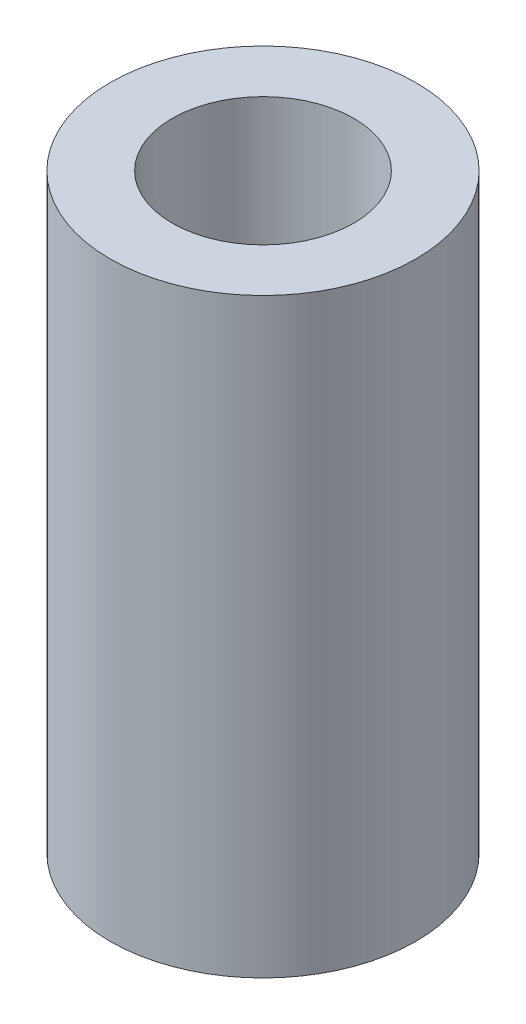
ISO-10303-21;
HEADER;
FILE_DESCRIPTION(('STEP AP214'),'2;1');
FILE_NAME('part.step','',(''),(''),'','','');
FILE_SCHEMA(('AUTOMOTIVE_DESIGN { 1 0 10303 214 1 1 1 1 }'));
ENDSEC;
DATA;
#1=APPLICATION_CONTEXT('core data for automotive mechanical design processes');
#2=APPLICATION_PROTOCOL_DEFINITION('international standard','automotive_design',2000,#1);
#3=PRODUCT_CONTEXT('',#1,'mechanical');
#4=PRODUCT('Part','Part','',(#3));
#5=PRODUCT_RELATED_PRODUCT_CATEGORY('part','',(#4));
#6=PRODUCT_DEFINITION_FORMATION('','',#4);
#7=PRODUCT_DEFINITION_CONTEXT('part definition',#1,'design');
#8=PRODUCT_DEFINITION('design','',#6,#7);
#9=PRODUCT_DEFINITION_SHAPE('','',#8);
#10=(LENGTH_UNIT() NAMED_UNIT(*) SI_UNIT(.MILLI.,.METRE.));
#11=(NAMED_UNIT(*) PLANE_ANGLE_UNIT() SI_UNIT($,.RADIAN.));
#12=(NAMED_UNIT(*) SI_UNIT($,.STERADIAN.) SOLID_ANGLE_UNIT());
#13=UNCERTAINTY_MEASURE_WITH_UNIT(LENGTH_MEASURE(1.E-05),#10,'distance_accuracy_value','');
#14=(GEOMETRIC_REPRESENTATION_CONTEXT(3) GLOBAL_UNCERTAINTY_ASSIGNED_CONTEXT((#13)) GLOBAL_UNIT_ASSIGNED_CONTEXT((#10,
#11,#12)) REPRESENTATION_CONTEXT('',''));
#15=CARTESIAN_POINT('',(0.,0.,0.));
#16=DIRECTION('',(0.,0.,1.));
#17=DIRECTION('',(1.,0.,0.));
#18=AXIS2_PLACEMENT_3D('',#15,#16,#17);
#19=CARTESIAN_POINT('',(0.,0.,0.));
#20=DIRECTION('',(0.,1.,0.));
#21=DIRECTION('',(0.,0.,1.));
#22=AXIS2_PLACEMENT_3D('',#19,#20,#21);
#23=PLANE('',#22);
#24=CARTESIAN_POINT('',(0.,0.,0.));
#25=DIRECTION('',(0.,1.,0.));
#26=DIRECTION('',(0.,0.,1.));
#27=AXIS2_PLACEMENT_3D('',#24,#25,#26);
#28=CIRCLE('',#27,8.001);
#29=CARTESIAN_POINT('',(0.,0.,8.001));
#30=VERTEX_POINT('',#29);
#31=EDGE_CURVE('E66',#30,#30,#28,.F.);
#32=ORIENTED_EDGE('',*,*,#31,.F.);
#33=EDGE_LOOP('',(#32));
#34=FACE_BOUND('',#33,.T.);
#35=CARTESIAN_POINT('',(0.,0.,0.));
#36=DIRECTION('',(0.,1.,0.));
#37=DIRECTION('',(0.,0.,1.));
#38=AXIS2_PLACEMENT_3D('',#35,#36,#37);
#39=CIRCLE('',#38,13.462);
#40=CARTESIAN_POINT('',(0.,0.,13.462));
#41=VERTEX_POINT('',#40);
#42=EDGE_CURVE('E56',#41,#41,#39,.T.);
#43=ORIENTED_EDGE('',*,*,#42,.F.);
#44=EDGE_LOOP('',(#43));
#45=FACE_BOUND('',#44,.T.);
#46=ADVANCED_FACE('F49',(#34,#45),#23,.F.);
#47=CARTESIAN_POINT('',(0.,52.07,0.));
#48=DIRECTION('',(0.,1.,0.));
#49=DIRECTION('',(0.,0.,1.));
#50=AXIS2_PLACEMENT_3D('',#47,#48,#49);
#51=PLANE('',#50);
#52=CARTESIAN_POINT('',(0.,52.07,0.));
#53=DIRECTION('',(0.,1.,0.));
#54=DIRECTION('',(0.,0.,1.));
#55=AXIS2_PLACEMENT_3D('',#52,#53,#54);
#56=CIRCLE('',#55,8.001);
#57=CARTESIAN_POINT('',(0.,52.07,8.001));
#58=VERTEX_POINT('',#57);
#59=EDGE_CURVE('E61',#58,#58,#56,.F.);
#60=ORIENTED_EDGE('',*,*,#59,.T.);
#61=EDGE_LOOP('',(#60));
#62=FACE_BOUND('',#61,.T.);
#63=CARTESIAN_POINT('',(0.,52.07,0.));
#64=DIRECTION('',(0.,1.,0.));
#65=DIRECTION('',(0.,0.,1.));
#66=AXIS2_PLACEMENT_3D('',#63,#64,#65);
#67=CIRCLE('',#66,13.462);
#68=CARTESIAN_POINT('',(0.,52.07,13.462));
#69=VERTEX_POINT('',#68);
#70=EDGE_CURVE('E11',#69,#69,#67,.T.);
#71=ORIENTED_EDGE('',*,*,#70,.T.);
#72=EDGE_LOOP('',(#71));
#73=FACE_BOUND('',#72,.T.);
#74=ADVANCED_FACE('F78',(#62,#73),#51,.T.);
#75=CARTESIAN_POINT('',(0.,0.,0.));
#76=DIRECTION('',(0.,1.,0.));
#77=DIRECTION('',(0.,0.,1.));
#78=AXIS2_PLACEMENT_3D('',#75,#76,#77);
#79=CYLINDRICAL_SURFACE('',#78,13.462);
#80=ORIENTED_EDGE('',*,*,#70,.F.);
#81=EDGE_LOOP('',(#80));
#82=FACE_BOUND('',#81,.T.);
#83=ORIENTED_EDGE('',*,*,#42,.T.);
#84=EDGE_LOOP('',(#83));
#85=FACE_BOUND('',#84,.T.);
#86=ADVANCED_FACE('F82',(#82,#85),#79,.T.);
#87=CARTESIAN_POINT('',(0.,-4.,0.));
#88=DIRECTION('',(0.,1.,0.));
#89=DIRECTION('',(0.,0.,1.));
#90=AXIS2_PLACEMENT_3D('',#87,#88,#89);
#91=CYLINDRICAL_SURFACE('',#90,8.001);
#92=ORIENTED_EDGE('',*,*,#31,.T.);
#93=EDGE_LOOP('',(#92));
#94=FACE_BOUND('',#93,.T.);
#95=ORIENTED_EDGE('',*,*,#59,.F.);
#96=EDGE_LOOP('',(#95));
#97=FACE_BOUND('',#96,.T.);
#98=ADVANCED_FACE('F73',(#94,#97),#91,.F.);
#99=CLOSED_SHELL('',(#46,#74,#86,#98));
#100=MANIFOLD_SOLID_BREP('B2',#99);
#101=ADVANCED_BREP_SHAPE_REPRESENTATION('',(#18,#100),#14);
#102=SHAPE_DEFINITION_REPRESENTATION(#9,#101);
ENDSEC;
END-ISO-10303-21;
